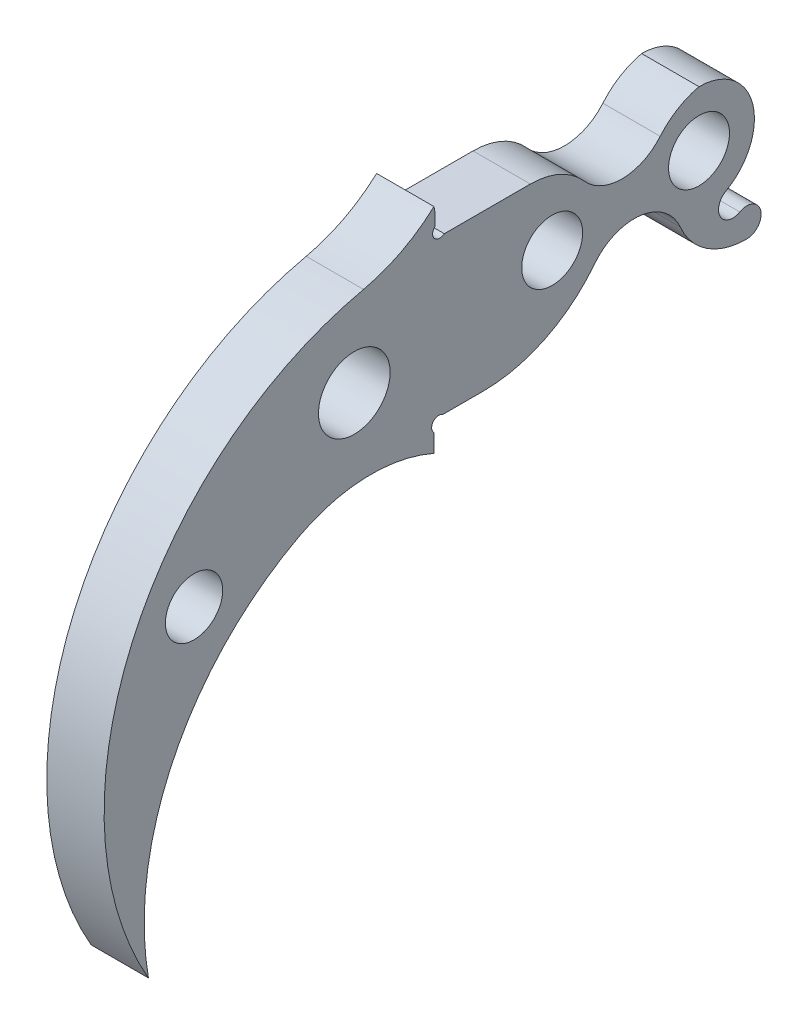
ISO-10303-21;
HEADER;
FILE_DESCRIPTION(('STEP AP214'),'2;1');
FILE_NAME('part.step','',(''),(''),'','','');
FILE_SCHEMA(('AUTOMOTIVE_DESIGN { 1 0 10303 214 1 1 1 1 }'));
ENDSEC;
DATA;
#1=APPLICATION_CONTEXT('core data for automotive mechanical design processes');
#2=APPLICATION_PROTOCOL_DEFINITION('international standard','automotive_design',2000,#1);
#3=PRODUCT_CONTEXT('',#1,'mechanical');
#4=PRODUCT('Part','Part','',(#3));
#5=PRODUCT_RELATED_PRODUCT_CATEGORY('part','',(#4));
#6=PRODUCT_DEFINITION_FORMATION('','',#4);
#7=PRODUCT_DEFINITION_CONTEXT('part definition',#1,'design');
#8=PRODUCT_DEFINITION('design','',#6,#7);
#9=PRODUCT_DEFINITION_SHAPE('','',#8);
#10=(LENGTH_UNIT() NAMED_UNIT(*) SI_UNIT(.MILLI.,.METRE.));
#11=(NAMED_UNIT(*) PLANE_ANGLE_UNIT() SI_UNIT($,.RADIAN.));
#12=(NAMED_UNIT(*) SI_UNIT($,.STERADIAN.) SOLID_ANGLE_UNIT());
#13=UNCERTAINTY_MEASURE_WITH_UNIT(LENGTH_MEASURE(1.E-05),#10,'distance_accuracy_value','');
#14=(GEOMETRIC_REPRESENTATION_CONTEXT(3) GLOBAL_UNCERTAINTY_ASSIGNED_CONTEXT((#13)) GLOBAL_UNIT_ASSIGNED_CONTEXT((#10,
#11,#12)) REPRESENTATION_CONTEXT('',''));
#15=CARTESIAN_POINT('',(0.,0.,0.));
#16=DIRECTION('',(0.,0.,1.));
#17=DIRECTION('',(1.,0.,0.));
#18=AXIS2_PLACEMENT_3D('',#15,#16,#17);
#19=CARTESIAN_POINT('',(262.7,196.026039352418,574.915264072567));
#20=DIRECTION('',(0.,0.173648177666923,-0.984807753012209));
#21=DIRECTION('',(0.,0.984807753012209,0.173648177666923));
#22=AXIS2_PLACEMENT_3D('',#19,#20,#21);
#23=PLANE('',#22);
#24=DIRECTION('',(0.,-0.984807753012209,-0.173648177666923));
#25=VECTOR('',#24,1.);
#26=CARTESIAN_POINT('',(270.7,196.026039352418,574.915264072567));
#27=LINE('',#26,#25);
#28=CARTESIAN_POINT('',(270.7,199.839030724963,575.587597328755));
#29=VERTEX_POINT('',#28);
#30=CARTESIAN_POINT('',(270.7,198.84824590337,575.412895232632));
#31=VERTEX_POINT('',#30);
#32=EDGE_CURVE('E291',#29,#31,#27,.T.);
#33=ORIENTED_EDGE('',*,*,#32,.T.);
#34=DIRECTION('',(-1.,0.,0.));
#35=VECTOR('',#34,1.);
#36=CARTESIAN_POINT('',(243.132171481362,198.84824590337,575.412895232632));
#37=LINE('',#36,#35);
#38=CARTESIAN_POINT('',(262.7,198.84824590337,575.412895232632));
#39=VERTEX_POINT('',#38);
#40=EDGE_CURVE('E234',#31,#39,#37,.T.);
#41=ORIENTED_EDGE('',*,*,#40,.T.);
#42=DIRECTION('',(0.,0.984807753012209,0.173648177666923));
#43=VECTOR('',#42,1.);
#44=CARTESIAN_POINT('',(262.7,196.026039352418,574.915264072567));
#45=LINE('',#44,#43);
#46=CARTESIAN_POINT('',(262.7,199.839030724963,575.587597328755));
#47=VERTEX_POINT('',#46);
#48=EDGE_CURVE('E354',#39,#47,#45,.T.);
#49=ORIENTED_EDGE('',*,*,#48,.T.);
#50=DIRECTION('',(1.,0.,0.));
#51=VECTOR('',#50,1.);
#52=CARTESIAN_POINT('',(243.132171481362,199.839030724963,575.587597328755));
#53=LINE('',#52,#51);
#54=EDGE_CURVE('E351',#47,#29,#53,.T.);
#55=ORIENTED_EDGE('',*,*,#54,.T.);
#56=EDGE_LOOP('',(#33,#41,#49,#55));
#57=FACE_BOUND('',#56,.T.);
#58=ADVANCED_FACE('F38',(#57),#23,.T.);
#59=CARTESIAN_POINT('',(243.132171481362,215.729406191826,590.067367807445));
#60=DIRECTION('',(1.,0.,0.));
#61=DIRECTION('',(0.,0.,1.));
#62=AXIS2_PLACEMENT_3D('',#59,#60,#61);
#63=CYLINDRICAL_SURFACE('',#62,21.4980879520342);
#64=CARTESIAN_POINT('',(270.7,215.729406191826,590.067367807445));
#65=DIRECTION('',(1.,0.,0.));
#66=DIRECTION('',(0.,0.,-1.));
#67=AXIS2_PLACEMENT_3D('',#64,#65,#66);
#68=CIRCLE('',#67,21.4980879520342);
#69=CARTESIAN_POINT('',(270.7,194.741226884327,585.412895232632));
#70=VERTEX_POINT('',#69);
#71=EDGE_CURVE('E307',#70,#29,#68,.T.);
#72=ORIENTED_EDGE('',*,*,#71,.T.);
#73=ORIENTED_EDGE('',*,*,#54,.F.);
#74=CARTESIAN_POINT('',(262.7,215.729406191826,590.067367807445));
#75=DIRECTION('',(1.,0.,0.));
#76=DIRECTION('',(0.,0.,-1.));
#77=AXIS2_PLACEMENT_3D('',#74,#75,#76);
#78=CIRCLE('',#77,21.4980879520342);
#79=CARTESIAN_POINT('',(262.7,194.741226884327,585.412895232632));
#80=VERTEX_POINT('',#79);
#81=EDGE_CURVE('E343',#80,#47,#78,.T.);
#82=ORIENTED_EDGE('',*,*,#81,.F.);
#83=DIRECTION('',(1.,0.,0.));
#84=VECTOR('',#83,1.);
#85=CARTESIAN_POINT('',(243.132171481362,194.741226884327,585.412895232632));
#86=LINE('',#85,#84);
#87=EDGE_CURVE('E335',#80,#70,#86,.T.);
#88=ORIENTED_EDGE('',*,*,#87,.T.);
#89=EDGE_LOOP('',(#72,#73,#82,#88));
#90=FACE_BOUND('',#89,.T.);
#91=ADVANCED_FACE('F409',(#90),#63,.F.);
#92=CARTESIAN_POINT('',(279.7,149.648729356098,575.412895232632));
#93=DIRECTION('',(-1.,0.,0.));
#94=DIRECTION('',(0.,0.,-1.));
#95=AXIS2_PLACEMENT_3D('',#92,#93,#94);
#96=CYLINDRICAL_SURFACE('',#95,46.18802153517);
#97=CARTESIAN_POINT('',(270.7,149.648729356098,575.412895232632));
#98=DIRECTION('',(1.,0.,0.));
#99=DIRECTION('',(0.,0.,-1.));
#100=AXIS2_PLACEMENT_3D('',#97,#98,#99);
#101=CIRCLE('',#100,46.18802153517);
#102=CARTESIAN_POINT('',(270.7,126.554718588514,615.412895232632));
#103=VERTEX_POINT('',#102);
#104=EDGE_CURVE('E305',#103,#70,#101,.F.);
#105=ORIENTED_EDGE('',*,*,#104,.T.);
#106=ORIENTED_EDGE('',*,*,#87,.F.);
#107=CARTESIAN_POINT('',(262.7,149.648729356098,575.412895232632));
#108=DIRECTION('',(1.,0.,0.));
#109=DIRECTION('',(0.,0.,1.));
#110=AXIS2_PLACEMENT_3D('',#107,#108,#109);
#111=CIRCLE('',#110,46.18802153517);
#112=CARTESIAN_POINT('',(262.7,126.554718588514,615.412895232632));
#113=VERTEX_POINT('',#112);
#114=EDGE_CURVE('E227',#80,#113,#111,.T.);
#115=ORIENTED_EDGE('',*,*,#114,.T.);
#116=DIRECTION('',(-1.,0.,0.));
#117=VECTOR('',#116,1.);
#118=CARTESIAN_POINT('',(279.7,126.554718588514,615.412895232632));
#119=LINE('',#118,#117);
#120=EDGE_CURVE('E231',#103,#113,#119,.T.);
#121=ORIENTED_EDGE('',*,*,#120,.F.);
#122=EDGE_LOOP('',(#105,#106,#115,#121));
#123=FACE_BOUND('',#122,.T.);
#124=ADVANCED_FACE('F415',(#123),#96,.T.);
#125=CARTESIAN_POINT('',(243.132171481362,150.383315623667,584.347712232947));
#126=DIRECTION('',(1.,0.,0.));
#127=DIRECTION('',(0.,0.,1.));
#128=AXIS2_PLACEMENT_3D('',#125,#126,#127);
#129=CYLINDRICAL_SURFACE('',#128,21.4980879520342);
#130=CARTESIAN_POINT('',(270.7,150.383315623667,584.347712232947));
#131=DIRECTION('',(1.,0.,0.));
#132=DIRECTION('',(0.,0.,-1.));
#133=AXIS2_PLACEMENT_3D('',#130,#131,#132);
#134=CIRCLE('',#133,21.4980879520342);
#135=CARTESIAN_POINT('',(270.7,170.026908919304,575.612895232632));
#136=VERTEX_POINT('',#135);
#137=CARTESIAN_POINT('',(270.7,169.384333510383,594.404009009699));
#138=VERTEX_POINT('',#137);
#139=EDGE_CURVE('E277',#136,#138,#134,.T.);
#140=ORIENTED_EDGE('',*,*,#139,.T.);
#141=DIRECTION('',(1.,0.,0.));
#142=VECTOR('',#141,1.);
#143=CARTESIAN_POINT('',(243.132171481362,169.384333510383,594.404009009699));
#144=LINE('',#143,#142);
#145=CARTESIAN_POINT('',(262.7,169.384333510383,594.404009009699));
#146=VERTEX_POINT('',#145);
#147=EDGE_CURVE('E345',#146,#138,#144,.T.);
#148=ORIENTED_EDGE('',*,*,#147,.F.);
#149=CARTESIAN_POINT('',(262.7,150.383315623667,584.347712232947));
#150=DIRECTION('',(1.,0.,0.));
#151=DIRECTION('',(0.,0.,-1.));
#152=AXIS2_PLACEMENT_3D('',#149,#150,#151);
#153=CIRCLE('',#152,21.4980879520342);
#154=CARTESIAN_POINT('',(262.7,170.026908919304,575.612895232632));
#155=VERTEX_POINT('',#154);
#156=EDGE_CURVE('E348',#155,#146,#153,.T.);
#157=ORIENTED_EDGE('',*,*,#156,.F.);
#158=DIRECTION('',(1.,0.,0.));
#159=VECTOR('',#158,1.);
#160=CARTESIAN_POINT('',(243.132171481362,170.026908919304,575.612895232632));
#161=LINE('',#160,#159);
#162=EDGE_CURVE('E357',#136,#155,#161,.F.);
#163=ORIENTED_EDGE('',*,*,#162,.F.);
#164=EDGE_LOOP('',(#140,#148,#157,#163));
#165=FACE_BOUND('',#164,.T.);
#166=ADVANCED_FACE('F422',(#165),#129,.F.);
#167=CARTESIAN_POINT('',(243.132171481362,195.836750891268,575.412895232632));
#168=DIRECTION('',(0.,0.,-1.));
#169=DIRECTION('',(1.,0.,0.));
#170=AXIS2_PLACEMENT_3D('',#167,#168,#169);
#171=PLANE('',#170);
#172=DIRECTION('',(0.,-1.,0.));
#173=VECTOR('',#172,1.);
#174=CARTESIAN_POINT('',(270.7,195.836750891268,575.412895232632));
#175=LINE('',#174,#173);
#176=CARTESIAN_POINT('',(270.7,197.384123041006,575.412895232632));
#177=VERTEX_POINT('',#176);
#178=EDGE_CURVE('E302',#31,#177,#175,.T.);
#179=ORIENTED_EDGE('',*,*,#178,.T.);
#180=DIRECTION('',(1.,0.,0.));
#181=VECTOR('',#180,1.);
#182=CARTESIAN_POINT('',(262.7,197.384123041006,575.412895232632));
#183=LINE('',#182,#181);
#184=CARTESIAN_POINT('',(262.7,197.384123041006,575.412895232632));
#185=VERTEX_POINT('',#184);
#186=EDGE_CURVE('E374',#177,#185,#183,.F.);
#187=ORIENTED_EDGE('',*,*,#186,.T.);
#188=DIRECTION('',(0.,-1.,0.));
#189=VECTOR('',#188,1.);
#190=CARTESIAN_POINT('',(262.7,195.836750891268,575.412895232632));
#191=LINE('',#190,#189);
#192=EDGE_CURVE('E340',#39,#185,#191,.T.);
#193=ORIENTED_EDGE('',*,*,#192,.F.);
#194=ORIENTED_EDGE('',*,*,#40,.F.);
#195=EDGE_LOOP('',(#179,#187,#193,#194));
#196=FACE_BOUND('',#195,.T.);
#197=ADVANCED_FACE('F425',(#196),#171,.T.);
#198=CARTESIAN_POINT('',(279.7,188.104455092555,538.616481200262));
#199=DIRECTION('',(-1.,0.,0.));
#200=DIRECTION('',(0.,0.,-1.));
#201=AXIS2_PLACEMENT_3D('',#198,#199,#200);
#202=CYLINDRICAL_SURFACE('',#201,7.73229579871333);
#203=CARTESIAN_POINT('',(270.7,188.104455092555,538.616481200262));
#204=DIRECTION('',(1.,0.,0.));
#205=DIRECTION('',(0.,0.,-1.));
#206=AXIS2_PLACEMENT_3D('',#203,#204,#205);
#207=CIRCLE('',#206,7.73229579871333);
#208=CARTESIAN_POINT('',(270.7,195.836750891268,538.616481200262));
#209=VERTEX_POINT('',#208);
#210=CARTESIAN_POINT('',(270.7,181.345061103481,534.861618856677));
#211=VERTEX_POINT('',#210);
#212=EDGE_CURVE('E286',#209,#211,#207,.F.);
#213=ORIENTED_EDGE('',*,*,#212,.T.);
#214=DIRECTION('',(-1.,0.,0.));
#215=VECTOR('',#214,1.);
#216=CARTESIAN_POINT('',(279.7,181.345061103481,534.861618856677));
#217=LINE('',#216,#215);
#218=CARTESIAN_POINT('',(262.7,181.345061103481,534.861618856677));
#219=VERTEX_POINT('',#218);
#220=EDGE_CURVE('E238',#211,#219,#217,.T.);
#221=ORIENTED_EDGE('',*,*,#220,.T.);
#222=CARTESIAN_POINT('',(262.7,188.104455092555,538.616481200262));
#223=DIRECTION('',(1.,0.,0.));
#224=DIRECTION('',(0.,0.,1.));
#225=AXIS2_PLACEMENT_3D('',#222,#223,#224);
#226=CIRCLE('',#225,7.73229579871333);
#227=CARTESIAN_POINT('',(262.7,195.836750891268,538.616481200262));
#228=VERTEX_POINT('',#227);
#229=EDGE_CURVE('E221',#219,#228,#226,.T.);
#230=ORIENTED_EDGE('',*,*,#229,.T.);
#231=DIRECTION('',(-1.,0.,0.));
#232=VECTOR('',#231,1.);
#233=CARTESIAN_POINT('',(279.7,195.836750891268,538.616481200262));
#234=LINE('',#233,#232);
#235=EDGE_CURVE('E235',#209,#228,#234,.T.);
#236=ORIENTED_EDGE('',*,*,#235,.F.);
#237=EDGE_LOOP('',(#213,#221,#230,#236));
#238=FACE_BOUND('',#237,.T.);
#239=ADVANCED_FACE('F428',(#238),#202,.T.);
#240=CARTESIAN_POINT('',(262.7,177.411921940979,547.653612094658));
#241=DIRECTION('',(1.,0.,0.));
#242=DIRECTION('',(0.,0.,1.));
#243=AXIS2_PLACEMENT_3D('',#240,#241,#242);
#244=CYLINDRICAL_SURFACE('',#243,7.00000000000005);
#245=DIRECTION('',(1.,0.,0.));
#246=VECTOR('',#245,1.);
#247=CARTESIAN_POINT('',(262.7,181.708670636384,553.179727425389));
#248=LINE('',#247,#246);
#249=CARTESIAN_POINT('',(262.7,181.708670636384,553.179727425389));
#250=VERTEX_POINT('',#249);
#251=CARTESIAN_POINT('',(270.7,181.708670636384,553.179727425389));
#252=VERTEX_POINT('',#251);
#253=EDGE_CURVE('E365',#250,#252,#248,.T.);
#254=ORIENTED_EDGE('',*,*,#253,.F.);
#255=CARTESIAN_POINT('',(262.7,177.411921940979,547.653612094658));
#256=DIRECTION('',(-1.,0.,0.));
#257=DIRECTION('',(0.,0.,1.));
#258=AXIS2_PLACEMENT_3D('',#255,#256,#257);
#259=CIRCLE('',#258,7.00000000000005);
#260=CARTESIAN_POINT('',(262.7,180.16583643587,541.21808919789));
#261=VERTEX_POINT('',#260);
#262=EDGE_CURVE('E371',#250,#261,#259,.T.);
#263=ORIENTED_EDGE('',*,*,#262,.T.);
#264=DIRECTION('',(1.,0.,0.));
#265=VECTOR('',#264,1.);
#266=CARTESIAN_POINT('',(262.7,180.16583643587,541.21808919789));
#267=LINE('',#266,#265);
#268=CARTESIAN_POINT('',(270.7,180.16583643587,541.21808919789));
#269=VERTEX_POINT('',#268);
#270=EDGE_CURVE('E263',#269,#261,#267,.F.);
#271=ORIENTED_EDGE('',*,*,#270,.F.);
#272=CARTESIAN_POINT('',(270.7,177.411921940979,547.653612094658));
#273=DIRECTION('',(1.,0.,0.));
#274=DIRECTION('',(0.,0.,-1.));
#275=AXIS2_PLACEMENT_3D('',#272,#273,#274);
#276=CIRCLE('',#275,7.00000000000005);
#277=EDGE_CURVE('E270',#252,#269,#276,.F.);
#278=ORIENTED_EDGE('',*,*,#277,.F.);
#279=EDGE_LOOP('',(#254,#263,#271,#278));
#280=FACE_BOUND('',#279,.T.);
#281=ADVANCED_FACE('F438',(#280),#244,.F.);
#282=CARTESIAN_POINT('',(262.7,133.501294199042,575.412895232632));
#283=DIRECTION('',(-1.,0.,0.));
#284=DIRECTION('',(0.,0.,-1.));
#285=AXIS2_PLACEMENT_3D('',#282,#283,#284);
#286=PLANE('',#285);
#287=CARTESIAN_POINT('',(262.7,182.884251733324,586.700815687122));
#288=DIRECTION('',(1.,0.,0.));
#289=DIRECTION('',(0.,0.,-1.));
#290=AXIS2_PLACEMENT_3D('',#287,#288,#289);
#291=CIRCLE('',#290,5.00000000000005);
#292=CARTESIAN_POINT('',(262.7,182.884251733324,581.700815687122));
#293=VERTEX_POINT('',#292);
#294=EDGE_CURVE('E384',#293,#293,#291,.T.);
#295=ORIENTED_EDGE('',*,*,#294,.T.);
#296=EDGE_LOOP('',(#295));
#297=FACE_BOUND('',#296,.T.);
#298=CARTESIAN_POINT('',(262.7,168.229989587665,609.056718381586));
#299=DIRECTION('',(1.,0.,0.));
#300=DIRECTION('',(0.,0.,-1.));
#301=AXIS2_PLACEMENT_3D('',#298,#299,#300);
#302=CIRCLE('',#301,3.99999999999999);
#303=CARTESIAN_POINT('',(262.7,168.229989587665,605.056718381586));
#304=VERTEX_POINT('',#303);
#305=EDGE_CURVE('E202',#304,#304,#302,.T.);
#306=ORIENTED_EDGE('',*,*,#305,.T.);
#307=EDGE_LOOP('',(#306));
#308=FACE_BOUND('',#307,.T.);
#309=CARTESIAN_POINT('',(262.7,197.065263328418,549.373056666464));
#310=DIRECTION('',(-1.,0.,0.));
#311=DIRECTION('',(0.,0.,1.));
#312=AXIS2_PLACEMENT_3D('',#309,#310,#311);
#313=CIRCLE('',#312,7.00000000000004);
#314=CARTESIAN_POINT('',(262.7,192.544822953149,544.028375308923));
#315=VERTEX_POINT('',#314);
#316=CARTESIAN_POINT('',(262.7,192.441758207239,554.628834477067));
#317=VERTEX_POINT('',#316);
#318=EDGE_CURVE('E362',#315,#317,#313,.T.);
#319=ORIENTED_EDGE('',*,*,#318,.F.);
#320=CARTESIAN_POINT('',(262.7,186.08705098848,536.393116226722));
#321=DIRECTION('',(1.,0.,0.));
#322=DIRECTION('',(0.,0.,-1.));
#323=AXIS2_PLACEMENT_3D('',#320,#321,#322);
#324=CIRCLE('',#323,10.);
#325=EDGE_CURVE('E254',#228,#315,#324,.T.);
#326=ORIENTED_EDGE('',*,*,#325,.F.);
#327=ORIENTED_EDGE('',*,*,#229,.F.);
#328=CARTESIAN_POINT('',(262.7,179.596707402321,533.890403465716));
#329=DIRECTION('',(-1.,0.,0.));
#330=DIRECTION('',(0.,0.,-1.));
#331=AXIS2_PLACEMENT_3D('',#328,#329,#330);
#332=CIRCLE('',#331,2.00000000000003);
#333=CARTESIAN_POINT('',(262.7,177.84835370116,532.919188074756));
#334=VERTEX_POINT('',#333);
#335=EDGE_CURVE('E213',#334,#219,#332,.T.);
#336=ORIENTED_EDGE('',*,*,#335,.F.);
#337=CARTESIAN_POINT('',(262.7,176.1,531.947972683795));
#338=DIRECTION('',(1.,0.,0.));
#339=DIRECTION('',(0.,0.,-1.));
#340=AXIS2_PLACEMENT_3D('',#337,#338,#339);
#341=CIRCLE('',#340,2.);
#342=CARTESIAN_POINT('',(262.7,174.1,531.947972683795));
#343=VERTEX_POINT('',#342);
#344=EDGE_CURVE('E209',#343,#334,#341,.T.);
#345=ORIENTED_EDGE('',*,*,#344,.F.);
#346=DIRECTION('',(0.,0.,-1.));
#347=VECTOR('',#346,1.);
#348=CARTESIAN_POINT('',(262.7,174.1,575.412895232632));
#349=LINE('',#348,#347);
#350=CARTESIAN_POINT('',(262.7,174.1,532.024485059649));
#351=VERTEX_POINT('',#350);
#352=EDGE_CURVE('E210',#351,#343,#349,.T.);
#353=ORIENTED_EDGE('',*,*,#352,.F.);
#354=CARTESIAN_POINT('',(262.7,184.1,532.024485059649));
#355=DIRECTION('',(1.,0.,0.));
#356=DIRECTION('',(0.,0.,-1.));
#357=AXIS2_PLACEMENT_3D('',#354,#355,#356);
#358=CIRCLE('',#357,10.);
#359=EDGE_CURVE('E251',#261,#351,#358,.T.);
#360=ORIENTED_EDGE('',*,*,#359,.F.);
#361=ORIENTED_EDGE('',*,*,#262,.F.);
#362=CARTESIAN_POINT('',(262.7,193.802457690172,568.733735067493));
#363=DIRECTION('',(1.,0.,0.));
#364=DIRECTION('',(0.,0.,1.));
#365=AXIS2_PLACEMENT_3D('',#362,#363,#364);
#366=CIRCLE('',#365,19.7024576901719);
#367=CARTESIAN_POINT('',(262.7,174.1,568.733735067493));
#368=VERTEX_POINT('',#367);
#369=EDGE_CURVE('E208',#368,#250,#366,.T.);
#370=ORIENTED_EDGE('',*,*,#369,.F.);
#371=CARTESIAN_POINT('',(262.7,174.1,574.321642581518));
#372=VERTEX_POINT('',#371);
#373=EDGE_CURVE('E188',#372,#368,#349,.T.);
#374=ORIENTED_EDGE('',*,*,#373,.F.);
#375=CARTESIAN_POINT('',(262.7,173.290260041975,574.908431470624));
#376=DIRECTION('',(-1.,0.,0.));
#377=DIRECTION('',(0.,0.,1.));
#378=AXIS2_PLACEMENT_3D('',#375,#376,#377);
#379=CIRCLE('',#378,1.00000000000005);
#380=CARTESIAN_POINT('',(262.7,172.58052008395,575.612895232632));
#381=VERTEX_POINT('',#380);
#382=EDGE_CURVE('E197',#381,#372,#379,.T.);
#383=ORIENTED_EDGE('',*,*,#382,.F.);
#384=DIRECTION('',(0.,1.,0.));
#385=VECTOR('',#384,1.);
#386=CARTESIAN_POINT('',(262.7,-103.5,575.612895232632));
#387=LINE('',#386,#385);
#388=EDGE_CURVE('E360',#155,#381,#387,.T.);
#389=ORIENTED_EDGE('',*,*,#388,.F.);
#390=ORIENTED_EDGE('',*,*,#156,.T.);
#391=CARTESIAN_POINT('',(262.7,133.501294199042,575.412895232632));
#392=DIRECTION('',(-1.,0.,0.));
#393=DIRECTION('',(0.,0.,-1.));
#394=AXIS2_PLACEMENT_3D('',#391,#392,#393);
#395=CIRCLE('',#394,40.5987058009585);
#396=EDGE_CURVE('E216',#113,#146,#395,.T.);
#397=ORIENTED_EDGE('',*,*,#396,.F.);
#398=ORIENTED_EDGE('',*,*,#114,.F.);
#399=ORIENTED_EDGE('',*,*,#81,.T.);
#400=ORIENTED_EDGE('',*,*,#48,.F.);
#401=ORIENTED_EDGE('',*,*,#192,.T.);
#402=CARTESIAN_POINT('',(262.7,196.610436966137,574.779326090742));
#403=DIRECTION('',(-1.,0.,0.));
#404=DIRECTION('',(0.,0.,1.));
#405=AXIS2_PLACEMENT_3D('',#402,#403,#404);
#406=CIRCLE('',#405,1.00000000000005);
#407=CARTESIAN_POINT('',(262.7,195.836750891268,574.145756948853));
#408=VERTEX_POINT('',#407);
#409=EDGE_CURVE('E193',#408,#185,#406,.T.);
#410=ORIENTED_EDGE('',*,*,#409,.F.);
#411=DIRECTION('',(0.,0.,1.));
#412=VECTOR('',#411,1.);
#413=CARTESIAN_POINT('',(262.7,195.836750891268,575.412895232632));
#414=LINE('',#413,#412);
#415=CARTESIAN_POINT('',(262.7,195.836750891268,562.137088492214));
#416=VERTEX_POINT('',#415);
#417=EDGE_CURVE('E224',#416,#408,#414,.T.);
#418=ORIENTED_EDGE('',*,*,#417,.F.);
#419=CARTESIAN_POINT('',(262.7,185.836750891268,562.137088492214));
#420=DIRECTION('',(1.,0.,0.));
#421=DIRECTION('',(0.,0.,-1.));
#422=AXIS2_PLACEMENT_3D('',#419,#420,#421);
#423=CIRCLE('',#422,10.);
#424=EDGE_CURVE('E257',#317,#416,#423,.T.);
#425=ORIENTED_EDGE('',*,*,#424,.F.);
#426=EDGE_LOOP('',(#319,#326,#327,#336,#345,#353,#360,#361,#370,#374,#383,#389,#390,#397,#398,
#399,#400,#401,#410,#418,#425));
#427=FACE_BOUND('',#426,.T.);
#428=CARTESIAN_POINT('',(262.7,186.312329952889,559.100565279743));
#429=DIRECTION('',(1.,0.,0.));
#430=DIRECTION('',(0.,0.,-1.));
#431=AXIS2_PLACEMENT_3D('',#428,#429,#430);
#432=CIRCLE('',#431,4.25000000000001);
#433=CARTESIAN_POINT('',(262.7,186.312329952889,554.850565279743));
#434=VERTEX_POINT('',#433);
#435=EDGE_CURVE('E333',#434,#434,#432,.T.);
#436=ORIENTED_EDGE('',*,*,#435,.T.);
#437=EDGE_LOOP('',(#436));
#438=FACE_BOUND('',#437,.T.);
#439=CARTESIAN_POINT('',(262.7,188.104455092555,538.616481200262));
#440=DIRECTION('',(1.,0.,0.));
#441=DIRECTION('',(0.,0.,-1.));
#442=AXIS2_PLACEMENT_3D('',#439,#440,#441);
#443=CIRCLE('',#442,4.24999999999999);
#444=CARTESIAN_POINT('',(262.7,188.104455092555,534.366481200262));
#445=VERTEX_POINT('',#444);
#446=EDGE_CURVE('E331',#445,#445,#443,.T.);
#447=ORIENTED_EDGE('',*,*,#446,.T.);
#448=EDGE_LOOP('',(#447));
#449=FACE_BOUND('',#448,.T.);
#450=ADVANCED_FACE('F205',(#297,#308,#427,#438,#449),#286,.T.);
#451=CARTESIAN_POINT('',(279.7,174.1,575.412895232632));
#452=DIRECTION('',(0.,-1.,0.));
#453=DIRECTION('',(0.,0.,-1.));
#454=AXIS2_PLACEMENT_3D('',#451,#452,#453);
#455=PLANE('',#454);
#456=DIRECTION('',(0.,0.,1.));
#457=VECTOR('',#456,1.);
#458=CARTESIAN_POINT('',(270.7,174.1,575.412895232632));
#459=LINE('',#458,#457);
#460=CARTESIAN_POINT('',(270.7,174.1,531.947972683795));
#461=VERTEX_POINT('',#460);
#462=CARTESIAN_POINT('',(270.7,174.1,532.024485059649));
#463=VERTEX_POINT('',#462);
#464=EDGE_CURVE('E274',#461,#463,#459,.T.);
#465=ORIENTED_EDGE('',*,*,#464,.T.);
#466=DIRECTION('',(-1.,0.,0.));
#467=VECTOR('',#466,1.);
#468=CARTESIAN_POINT('',(278.7,174.1,532.024485059649));
#469=LINE('',#468,#467);
#470=EDGE_CURVE('E265',#351,#463,#469,.F.);
#471=ORIENTED_EDGE('',*,*,#470,.F.);
#472=ORIENTED_EDGE('',*,*,#352,.T.);
#473=DIRECTION('',(-1.,0.,0.));
#474=VECTOR('',#473,1.);
#475=CARTESIAN_POINT('',(279.7,174.1,531.947972683795));
#476=LINE('',#475,#474);
#477=EDGE_CURVE('E230',#461,#343,#476,.T.);
#478=ORIENTED_EDGE('',*,*,#477,.F.);
#479=EDGE_LOOP('',(#465,#471,#472,#478));
#480=FACE_BOUND('',#479,.T.);
#481=ADVANCED_FACE('F437',(#480),#455,.T.);
#482=CARTESIAN_POINT('',(262.7,184.1,532.024485059649));
#483=DIRECTION('',(1.,0.,0.));
#484=DIRECTION('',(0.,0.,1.));
#485=AXIS2_PLACEMENT_3D('',#482,#483,#484);
#486=CYLINDRICAL_SURFACE('',#485,10.);
#487=CARTESIAN_POINT('',(270.7,184.1,532.024485059649));
#488=DIRECTION('',(1.,0.,0.));
#489=DIRECTION('',(0.,0.,-1.));
#490=AXIS2_PLACEMENT_3D('',#487,#488,#489);
#491=CIRCLE('',#490,10.);
#492=EDGE_CURVE('E55',#463,#269,#491,.F.);
#493=ORIENTED_EDGE('',*,*,#492,.T.);
#494=ORIENTED_EDGE('',*,*,#270,.T.);
#495=ORIENTED_EDGE('',*,*,#359,.T.);
#496=ORIENTED_EDGE('',*,*,#470,.T.);
#497=EDGE_LOOP('',(#493,#494,#495,#496));
#498=FACE_BOUND('',#497,.T.);
#499=ADVANCED_FACE('F40',(#498),#486,.T.);
#500=CARTESIAN_POINT('',(262.7,197.065263328418,549.373056666464));
#501=DIRECTION('',(1.,0.,0.));
#502=DIRECTION('',(0.,0.,1.));
#503=AXIS2_PLACEMENT_3D('',#500,#501,#502);
#504=CYLINDRICAL_SURFACE('',#503,7.00000000000004);
#505=DIRECTION('',(1.,0.,0.));
#506=VECTOR('',#505,1.);
#507=CARTESIAN_POINT('',(262.7,192.544822953149,544.028375308923));
#508=LINE('',#507,#506);
#509=CARTESIAN_POINT('',(270.7,192.544822953149,544.028375308923));
#510=VERTEX_POINT('',#509);
#511=EDGE_CURVE('E246',#315,#510,#508,.T.);
#512=ORIENTED_EDGE('',*,*,#511,.F.);
#513=ORIENTED_EDGE('',*,*,#318,.T.);
#514=DIRECTION('',(1.,0.,0.));
#515=VECTOR('',#514,1.);
#516=CARTESIAN_POINT('',(262.7,192.441758207239,554.628834477067));
#517=LINE('',#516,#515);
#518=CARTESIAN_POINT('',(270.7,192.441758207239,554.628834477067));
#519=VERTEX_POINT('',#518);
#520=EDGE_CURVE('E249',#519,#317,#517,.F.);
#521=ORIENTED_EDGE('',*,*,#520,.F.);
#522=CARTESIAN_POINT('',(270.7,197.065263328418,549.373056666464));
#523=DIRECTION('',(1.,0.,0.));
#524=DIRECTION('',(0.,0.,-1.));
#525=AXIS2_PLACEMENT_3D('',#522,#523,#524);
#526=CIRCLE('',#525,7.00000000000004);
#527=EDGE_CURVE('E272',#510,#519,#526,.F.);
#528=ORIENTED_EDGE('',*,*,#527,.F.);
#529=EDGE_LOOP('',(#512,#513,#521,#528));
#530=FACE_BOUND('',#529,.T.);
#531=ADVANCED_FACE('F462',(#530),#504,.F.);
#532=CARTESIAN_POINT('',(279.7,186.08705098848,536.393116226722));
#533=DIRECTION('',(1.,0.,0.));
#534=DIRECTION('',(0.,0.,1.));
#535=AXIS2_PLACEMENT_3D('',#532,#533,#534);
#536=CYLINDRICAL_SURFACE('',#535,10.);
#537=CARTESIAN_POINT('',(270.7,186.08705098848,536.393116226722));
#538=DIRECTION('',(1.,0.,0.));
#539=DIRECTION('',(0.,0.,-1.));
#540=AXIS2_PLACEMENT_3D('',#537,#538,#539);
#541=CIRCLE('',#540,10.);
#542=EDGE_CURVE('E269',#510,#209,#541,.F.);
#543=ORIENTED_EDGE('',*,*,#542,.T.);
#544=ORIENTED_EDGE('',*,*,#235,.T.);
#545=ORIENTED_EDGE('',*,*,#325,.T.);
#546=ORIENTED_EDGE('',*,*,#511,.T.);
#547=EDGE_LOOP('',(#543,#544,#545,#546));
#548=FACE_BOUND('',#547,.T.);
#549=ADVANCED_FACE('F444',(#548),#536,.T.);
#550=CARTESIAN_POINT('',(279.7,195.836750891268,575.412895232632));
#551=DIRECTION('',(0.,1.,0.));
#552=DIRECTION('',(0.,0.,1.));
#553=AXIS2_PLACEMENT_3D('',#550,#551,#552);
#554=PLANE('',#553);
#555=DIRECTION('',(0.,0.,-1.));
#556=VECTOR('',#555,1.);
#557=CARTESIAN_POINT('',(270.7,195.836750891268,575.412895232632));
#558=LINE('',#557,#556);
#559=CARTESIAN_POINT('',(270.7,195.836750891268,574.145756948853));
#560=VERTEX_POINT('',#559);
#561=CARTESIAN_POINT('',(270.7,195.836750891268,562.137088492214));
#562=VERTEX_POINT('',#561);
#563=EDGE_CURVE('E292',#560,#562,#558,.T.);
#564=ORIENTED_EDGE('',*,*,#563,.T.);
#565=DIRECTION('',(-1.,0.,0.));
#566=VECTOR('',#565,1.);
#567=CARTESIAN_POINT('',(278.7,195.836750891268,562.137088492214));
#568=LINE('',#567,#566);
#569=EDGE_CURVE('E260',#416,#562,#568,.F.);
#570=ORIENTED_EDGE('',*,*,#569,.F.);
#571=ORIENTED_EDGE('',*,*,#417,.T.);
#572=DIRECTION('',(1.,0.,0.));
#573=VECTOR('',#572,1.);
#574=CARTESIAN_POINT('',(262.7,195.836750891268,574.145756948853));
#575=LINE('',#574,#573);
#576=EDGE_CURVE('E377',#408,#560,#575,.T.);
#577=ORIENTED_EDGE('',*,*,#576,.T.);
#578=EDGE_LOOP('',(#564,#570,#571,#577));
#579=FACE_BOUND('',#578,.T.);
#580=ADVANCED_FACE('F404',(#579),#554,.T.);
#581=CARTESIAN_POINT('',(262.7,185.836750891268,562.137088492214));
#582=DIRECTION('',(1.,0.,0.));
#583=DIRECTION('',(0.,0.,1.));
#584=AXIS2_PLACEMENT_3D('',#581,#582,#583);
#585=CYLINDRICAL_SURFACE('',#584,10.);
#586=CARTESIAN_POINT('',(270.7,185.836750891268,562.137088492214));
#587=DIRECTION('',(1.,0.,0.));
#588=DIRECTION('',(0.,0.,-1.));
#589=AXIS2_PLACEMENT_3D('',#586,#587,#588);
#590=CIRCLE('',#589,10.);
#591=EDGE_CURVE('E294',#562,#519,#590,.F.);
#592=ORIENTED_EDGE('',*,*,#591,.T.);
#593=ORIENTED_EDGE('',*,*,#520,.T.);
#594=ORIENTED_EDGE('',*,*,#424,.T.);
#595=ORIENTED_EDGE('',*,*,#569,.T.);
#596=EDGE_LOOP('',(#592,#593,#594,#595));
#597=FACE_BOUND('',#596,.T.);
#598=ADVANCED_FACE('F395',(#597),#585,.T.);
#599=CARTESIAN_POINT('',(270.7,182.884251733324,586.700815687122));
#600=DIRECTION('',(-1.,0.,0.));
#601=DIRECTION('',(0.,0.,-1.));
#602=AXIS2_PLACEMENT_3D('',#599,#600,#601);
#603=CYLINDRICAL_SURFACE('',#602,5.00000000000005);
#604=CARTESIAN_POINT('',(270.7,182.884251733324,586.700815687122));
#605=DIRECTION('',(1.,0.,0.));
#606=DIRECTION('',(0.,0.,-1.));
#607=AXIS2_PLACEMENT_3D('',#604,#605,#606);
#608=CIRCLE('',#607,5.00000000000005);
#609=CARTESIAN_POINT('',(270.7,182.884251733324,581.700815687122));
#610=VERTEX_POINT('',#609);
#611=EDGE_CURVE('E12',#610,#610,#608,.T.);
#612=ORIENTED_EDGE('',*,*,#611,.T.);
#613=EDGE_LOOP('',(#612));
#614=FACE_BOUND('',#613,.T.);
#615=ORIENTED_EDGE('',*,*,#294,.F.);
#616=EDGE_LOOP('',(#615));
#617=FACE_BOUND('',#616,.T.);
#618=ADVANCED_FACE('F392',(#614,#617),#603,.F.);
#619=CARTESIAN_POINT('',(270.7,168.229989587665,609.056718381586));
#620=DIRECTION('',(-1.,0.,0.));
#621=DIRECTION('',(0.,0.,-1.));
#622=AXIS2_PLACEMENT_3D('',#619,#620,#621);
#623=CYLINDRICAL_SURFACE('',#622,3.99999999999999);
#624=CARTESIAN_POINT('',(270.7,168.229989587665,609.056718381586));
#625=DIRECTION('',(1.,0.,0.));
#626=DIRECTION('',(0.,0.,-1.));
#627=AXIS2_PLACEMENT_3D('',#624,#625,#626);
#628=CIRCLE('',#627,3.99999999999999);
#629=CARTESIAN_POINT('',(270.7,168.229989587665,605.056718381586));
#630=VERTEX_POINT('',#629);
#631=EDGE_CURVE('E47',#630,#630,#628,.T.);
#632=ORIENTED_EDGE('',*,*,#631,.T.);
#633=EDGE_LOOP('',(#632));
#634=FACE_BOUND('',#633,.T.);
#635=ORIENTED_EDGE('',*,*,#305,.F.);
#636=EDGE_LOOP('',(#635));
#637=FACE_BOUND('',#636,.T.);
#638=ADVANCED_FACE('F394',(#634,#637),#623,.F.);
#639=DIRECTION('',(0.,0.,1.));
#640=VECTOR('',#639,1.);
#641=CARTESIAN_POINT('',(270.7,174.1,575.412895232632));
#642=LINE('',#641,#640);
#643=CARTESIAN_POINT('',(270.7,174.1,568.733735067493));
#644=VERTEX_POINT('',#643);
#645=CARTESIAN_POINT('',(270.7,174.1,574.321642581518));
#646=VERTEX_POINT('',#645);
#647=EDGE_CURVE('E191',#644,#646,#642,.T.);
#648=ORIENTED_EDGE('',*,*,#647,.T.);
#649=DIRECTION('',(1.,0.,0.));
#650=VECTOR('',#649,1.);
#651=CARTESIAN_POINT('',(262.7,174.1,574.321642581518));
#652=LINE('',#651,#650);
#653=EDGE_CURVE('E183',#646,#372,#652,.F.);
#654=ORIENTED_EDGE('',*,*,#653,.T.);
#655=ORIENTED_EDGE('',*,*,#373,.T.);
#656=DIRECTION('',(1.,0.,0.));
#657=VECTOR('',#656,1.);
#658=CARTESIAN_POINT('',(262.7,174.1,568.733735067493));
#659=LINE('',#658,#657);
#660=EDGE_CURVE('E366',#368,#644,#659,.T.);
#661=ORIENTED_EDGE('',*,*,#660,.T.);
#662=EDGE_LOOP('',(#648,#654,#655,#661));
#663=FACE_BOUND('',#662,.T.);
#664=ADVANCED_FACE('F185',(#663),#455,.T.);
#665=CARTESIAN_POINT('',(262.7,-103.5,575.612895232632));
#666=DIRECTION('',(0.,0.,-1.));
#667=DIRECTION('',(1.,0.,0.));
#668=AXIS2_PLACEMENT_3D('',#665,#666,#667);
#669=PLANE('',#668);
#670=DIRECTION('',(0.,-1.,0.));
#671=VECTOR('',#670,1.);
#672=CARTESIAN_POINT('',(270.7,-103.5,575.612895232632));
#673=LINE('',#672,#671);
#674=CARTESIAN_POINT('',(270.7,172.58052008395,575.612895232632));
#675=VERTEX_POINT('',#674);
#676=EDGE_CURVE('E282',#675,#136,#673,.T.);
#677=ORIENTED_EDGE('',*,*,#676,.T.);
#678=ORIENTED_EDGE('',*,*,#162,.T.);
#679=ORIENTED_EDGE('',*,*,#388,.T.);
#680=DIRECTION('',(1.,0.,0.));
#681=VECTOR('',#680,1.);
#682=CARTESIAN_POINT('',(262.7,172.58052008395,575.612895232632));
#683=LINE('',#682,#681);
#684=EDGE_CURVE('E194',#381,#675,#683,.T.);
#685=ORIENTED_EDGE('',*,*,#684,.T.);
#686=EDGE_LOOP('',(#677,#678,#679,#685));
#687=FACE_BOUND('',#686,.T.);
#688=ADVANCED_FACE('F420',(#687),#669,.T.);
#689=CARTESIAN_POINT('',(262.7,173.290260041975,574.908431470624));
#690=DIRECTION('',(1.,0.,0.));
#691=DIRECTION('',(0.,0.,1.));
#692=AXIS2_PLACEMENT_3D('',#689,#690,#691);
#693=CYLINDRICAL_SURFACE('',#692,1.00000000000005);
#694=ORIENTED_EDGE('',*,*,#684,.F.);
#695=ORIENTED_EDGE('',*,*,#382,.T.);
#696=ORIENTED_EDGE('',*,*,#653,.F.);
#697=CARTESIAN_POINT('',(270.7,173.290260041975,574.908431470624));
#698=DIRECTION('',(1.,0.,0.));
#699=DIRECTION('',(0.,0.,-1.));
#700=AXIS2_PLACEMENT_3D('',#697,#698,#699);
#701=CIRCLE('',#700,1.00000000000005);
#702=EDGE_CURVE('E267',#675,#646,#701,.F.);
#703=ORIENTED_EDGE('',*,*,#702,.F.);
#704=EDGE_LOOP('',(#694,#695,#696,#703));
#705=FACE_BOUND('',#704,.T.);
#706=ADVANCED_FACE('F198',(#705),#693,.F.);
#707=CARTESIAN_POINT('',(262.7,196.610436966137,574.779326090742));
#708=DIRECTION('',(1.,0.,0.));
#709=DIRECTION('',(0.,0.,1.));
#710=AXIS2_PLACEMENT_3D('',#707,#708,#709);
#711=CYLINDRICAL_SURFACE('',#710,1.00000000000005);
#712=ORIENTED_EDGE('',*,*,#576,.F.);
#713=ORIENTED_EDGE('',*,*,#409,.T.);
#714=ORIENTED_EDGE('',*,*,#186,.F.);
#715=CARTESIAN_POINT('',(270.7,196.610436966137,574.779326090742));
#716=DIRECTION('',(1.,0.,0.));
#717=DIRECTION('',(0.,0.,-1.));
#718=AXIS2_PLACEMENT_3D('',#715,#716,#717);
#719=CIRCLE('',#718,1.00000000000005);
#720=EDGE_CURVE('E279',#560,#177,#719,.F.);
#721=ORIENTED_EDGE('',*,*,#720,.F.);
#722=EDGE_LOOP('',(#712,#713,#714,#721));
#723=FACE_BOUND('',#722,.T.);
#724=ADVANCED_FACE('F482',(#723),#711,.F.);
#725=CARTESIAN_POINT('',(262.7,193.802457690172,568.733735067493));
#726=DIRECTION('',(1.,0.,0.));
#727=DIRECTION('',(0.,0.,1.));
#728=AXIS2_PLACEMENT_3D('',#725,#726,#727);
#729=CYLINDRICAL_SURFACE('',#728,19.7024576901719);
#730=ORIENTED_EDGE('',*,*,#660,.F.);
#731=ORIENTED_EDGE('',*,*,#369,.T.);
#732=ORIENTED_EDGE('',*,*,#253,.T.);
#733=CARTESIAN_POINT('',(270.7,193.802457690172,568.733735067493));
#734=DIRECTION('',(1.,0.,0.));
#735=DIRECTION('',(0.,0.,-1.));
#736=AXIS2_PLACEMENT_3D('',#733,#734,#735);
#737=CIRCLE('',#736,19.7024576901719);
#738=EDGE_CURVE('E273',#644,#252,#737,.T.);
#739=ORIENTED_EDGE('',*,*,#738,.F.);
#740=EDGE_LOOP('',(#730,#731,#732,#739));
#741=FACE_BOUND('',#740,.T.);
#742=ADVANCED_FACE('F432',(#741),#729,.T.);
#743=CARTESIAN_POINT('',(279.7,186.312329952889,559.100565279743));
#744=DIRECTION('',(-1.,0.,0.));
#745=DIRECTION('',(0.,0.,-1.));
#746=AXIS2_PLACEMENT_3D('',#743,#744,#745);
#747=CYLINDRICAL_SURFACE('',#746,4.25000000000001);
#748=CARTESIAN_POINT('',(270.7,186.312329952889,559.100565279743));
#749=DIRECTION('',(1.,0.,0.));
#750=DIRECTION('',(0.,0.,-1.));
#751=AXIS2_PLACEMENT_3D('',#748,#749,#750);
#752=CIRCLE('',#751,4.25000000000001);
#753=CARTESIAN_POINT('',(270.7,186.312329952889,554.850565279743));
#754=VERTEX_POINT('',#753);
#755=EDGE_CURVE('E298',#754,#754,#752,.F.);
#756=ORIENTED_EDGE('',*,*,#755,.F.);
#757=EDGE_LOOP('',(#756));
#758=FACE_BOUND('',#757,.T.);
#759=ORIENTED_EDGE('',*,*,#435,.F.);
#760=EDGE_LOOP('',(#759));
#761=FACE_BOUND('',#760,.T.);
#762=ADVANCED_FACE('F327',(#758,#761),#747,.F.);
#763=CARTESIAN_POINT('',(279.7,188.104455092555,538.616481200262));
#764=DIRECTION('',(-1.,0.,0.));
#765=DIRECTION('',(0.,0.,-1.));
#766=AXIS2_PLACEMENT_3D('',#763,#764,#765);
#767=CYLINDRICAL_SURFACE('',#766,4.24999999999999);
#768=CARTESIAN_POINT('',(270.7,188.104455092555,538.616481200262));
#769=DIRECTION('',(1.,0.,0.));
#770=DIRECTION('',(0.,0.,-1.));
#771=AXIS2_PLACEMENT_3D('',#768,#769,#770);
#772=CIRCLE('',#771,4.24999999999999);
#773=CARTESIAN_POINT('',(270.7,188.104455092555,534.366481200262));
#774=VERTEX_POINT('',#773);
#775=EDGE_CURVE('E42',#774,#774,#772,.F.);
#776=ORIENTED_EDGE('',*,*,#775,.F.);
#777=EDGE_LOOP('',(#776));
#778=FACE_BOUND('',#777,.T.);
#779=ORIENTED_EDGE('',*,*,#446,.F.);
#780=EDGE_LOOP('',(#779));
#781=FACE_BOUND('',#780,.T.);
#782=ADVANCED_FACE('F323',(#778,#781),#767,.F.);
#783=CARTESIAN_POINT('',(279.7,179.596707402321,533.890403465716));
#784=DIRECTION('',(-1.,0.,0.));
#785=DIRECTION('',(0.,0.,-1.));
#786=AXIS2_PLACEMENT_3D('',#783,#784,#785);
#787=CYLINDRICAL_SURFACE('',#786,2.00000000000003);
#788=CARTESIAN_POINT('',(270.7,179.596707402321,533.890403465716));
#789=DIRECTION('',(1.,0.,0.));
#790=DIRECTION('',(0.,0.,-1.));
#791=AXIS2_PLACEMENT_3D('',#788,#789,#790);
#792=CIRCLE('',#791,2.00000000000003);
#793=CARTESIAN_POINT('',(270.7,177.84835370116,532.919188074756));
#794=VERTEX_POINT('',#793);
#795=EDGE_CURVE('E283',#211,#794,#792,.T.);
#796=ORIENTED_EDGE('',*,*,#795,.T.);
#797=DIRECTION('',(-1.,0.,0.));
#798=VECTOR('',#797,1.);
#799=CARTESIAN_POINT('',(279.7,177.84835370116,532.919188074756));
#800=LINE('',#799,#798);
#801=EDGE_CURVE('E241',#794,#334,#800,.T.);
#802=ORIENTED_EDGE('',*,*,#801,.T.);
#803=ORIENTED_EDGE('',*,*,#335,.T.);
#804=ORIENTED_EDGE('',*,*,#220,.F.);
#805=EDGE_LOOP('',(#796,#802,#803,#804));
#806=FACE_BOUND('',#805,.T.);
#807=ADVANCED_FACE('F326',(#806),#787,.F.);
#808=CARTESIAN_POINT('',(279.7,176.1,531.947972683795));
#809=DIRECTION('',(-1.,0.,0.));
#810=DIRECTION('',(0.,0.,-1.));
#811=AXIS2_PLACEMENT_3D('',#808,#809,#810);
#812=CYLINDRICAL_SURFACE('',#811,2.);
#813=CARTESIAN_POINT('',(270.7,176.1,531.947972683795));
#814=DIRECTION('',(1.,0.,0.));
#815=DIRECTION('',(0.,0.,-1.));
#816=AXIS2_PLACEMENT_3D('',#813,#814,#815);
#817=CIRCLE('',#816,2.);
#818=EDGE_CURVE('E280',#794,#461,#817,.F.);
#819=ORIENTED_EDGE('',*,*,#818,.T.);
#820=ORIENTED_EDGE('',*,*,#477,.T.);
#821=ORIENTED_EDGE('',*,*,#344,.T.);
#822=ORIENTED_EDGE('',*,*,#801,.F.);
#823=EDGE_LOOP('',(#819,#820,#821,#822));
#824=FACE_BOUND('',#823,.T.);
#825=ADVANCED_FACE('F451',(#824),#812,.T.);
#826=CARTESIAN_POINT('',(279.7,133.501294199042,575.412895232632));
#827=DIRECTION('',(-1.,0.,0.));
#828=DIRECTION('',(0.,0.,-1.));
#829=AXIS2_PLACEMENT_3D('',#826,#827,#828);
#830=CYLINDRICAL_SURFACE('',#829,40.5987058009585);
#831=CARTESIAN_POINT('',(270.7,133.501294199042,575.412895232632));
#832=DIRECTION('',(1.,0.,0.));
#833=DIRECTION('',(0.,0.,-1.));
#834=AXIS2_PLACEMENT_3D('',#831,#832,#833);
#835=CIRCLE('',#834,40.5987058009585);
#836=EDGE_CURVE('E289',#138,#103,#835,.T.);
#837=ORIENTED_EDGE('',*,*,#836,.T.);
#838=ORIENTED_EDGE('',*,*,#120,.T.);
#839=ORIENTED_EDGE('',*,*,#396,.T.);
#840=ORIENTED_EDGE('',*,*,#147,.T.);
#841=EDGE_LOOP('',(#837,#838,#839,#840));
#842=FACE_BOUND('',#841,.T.);
#843=ADVANCED_FACE('F455',(#842),#830,.F.);
#844=CARTESIAN_POINT('',(270.7,177.101961244791,599.894079922415));
#845=DIRECTION('',(1.,0.,0.));
#846=DIRECTION('',(0.,0.,1.));
#847=AXIS2_PLACEMENT_3D('',#844,#845,#846);
#848=PLANE('',#847);
#849=ORIENTED_EDGE('',*,*,#755,.T.);
#850=EDGE_LOOP('',(#849));
#851=FACE_BOUND('',#850,.T.);
#852=ORIENTED_EDGE('',*,*,#631,.F.);
#853=EDGE_LOOP('',(#852));
#854=FACE_BOUND('',#853,.T.);
#855=ORIENTED_EDGE('',*,*,#611,.F.);
#856=EDGE_LOOP('',(#855));
#857=FACE_BOUND('',#856,.T.);
#858=ORIENTED_EDGE('',*,*,#563,.F.);
#859=ORIENTED_EDGE('',*,*,#720,.T.);
#860=ORIENTED_EDGE('',*,*,#178,.F.);
#861=ORIENTED_EDGE('',*,*,#32,.F.);
#862=ORIENTED_EDGE('',*,*,#71,.F.);
#863=ORIENTED_EDGE('',*,*,#104,.F.);
#864=ORIENTED_EDGE('',*,*,#836,.F.);
#865=ORIENTED_EDGE('',*,*,#139,.F.);
#866=ORIENTED_EDGE('',*,*,#676,.F.);
#867=ORIENTED_EDGE('',*,*,#702,.T.);
#868=ORIENTED_EDGE('',*,*,#647,.F.);
#869=ORIENTED_EDGE('',*,*,#738,.T.);
#870=ORIENTED_EDGE('',*,*,#277,.T.);
#871=ORIENTED_EDGE('',*,*,#492,.F.);
#872=ORIENTED_EDGE('',*,*,#464,.F.);
#873=ORIENTED_EDGE('',*,*,#818,.F.);
#874=ORIENTED_EDGE('',*,*,#795,.F.);
#875=ORIENTED_EDGE('',*,*,#212,.F.);
#876=ORIENTED_EDGE('',*,*,#542,.F.);
#877=ORIENTED_EDGE('',*,*,#527,.T.);
#878=ORIENTED_EDGE('',*,*,#591,.F.);
#879=EDGE_LOOP('',(#858,#859,#860,#861,#862,#863,#864,#865,#866,#867,#868,#869,#870,#871,#872,
#873,#874,#875,#876,#877,#878));
#880=FACE_BOUND('',#879,.T.);
#881=ORIENTED_EDGE('',*,*,#775,.T.);
#882=EDGE_LOOP('',(#881));
#883=FACE_BOUND('',#882,.T.);
#884=ADVANCED_FACE('F321',(#851,#854,#857,#880,#883),#848,.T.);
#885=CLOSED_SHELL('',(#58,#91,#124,#166,#197,#239,#281,#450,#481,#499,#531,#549,#580,#598,#618,
#638,#664,#688,#706,#724,#742,#762,#782,#807,#825,#843,#884));
#886=MANIFOLD_SOLID_BREP('B2',#885);
#887=ADVANCED_BREP_SHAPE_REPRESENTATION('',(#18,#886),#14);
#888=SHAPE_DEFINITION_REPRESENTATION(#9,#887);
ENDSEC;
END-ISO-10303-21;
